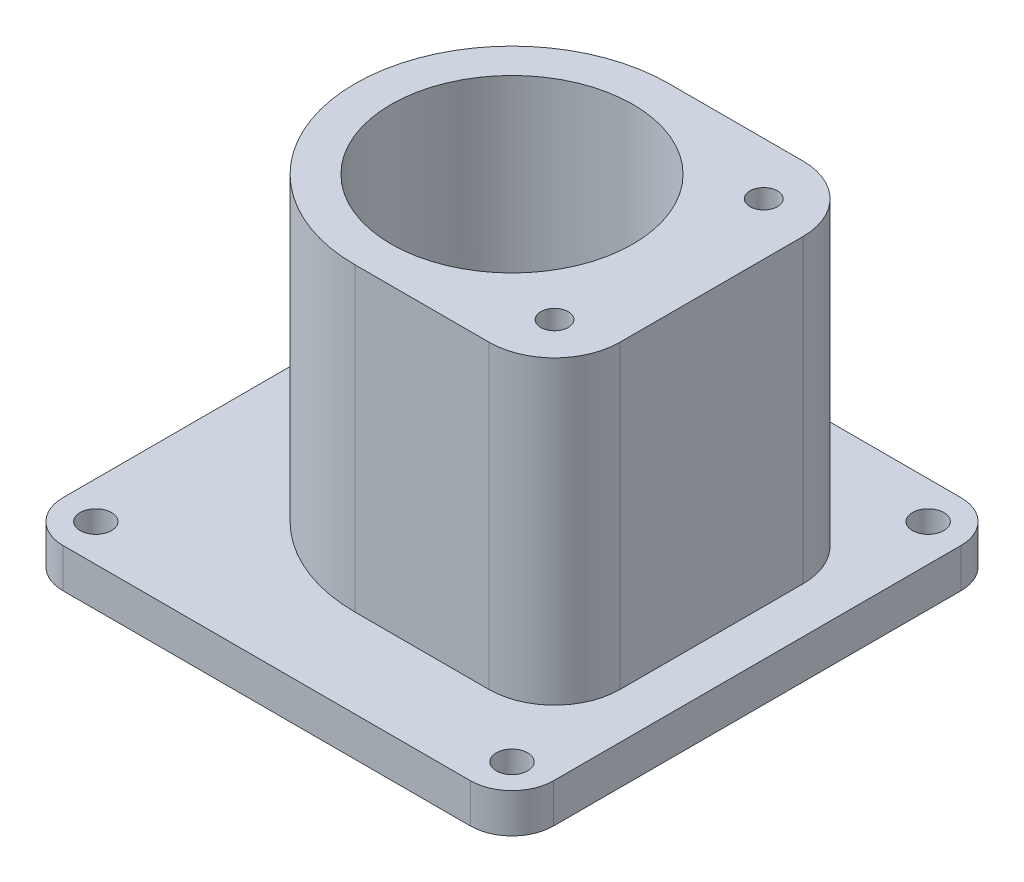
ISO-10303-21;
HEADER;
FILE_DESCRIPTION(('STEP AP214'),'2;1');
FILE_NAME('part.step','',(''),(''),'','','');
FILE_SCHEMA(('AUTOMOTIVE_DESIGN { 1 0 10303 214 1 1 1 1 }'));
ENDSEC;
DATA;
#1=APPLICATION_CONTEXT('core data for automotive mechanical design processes');
#2=APPLICATION_PROTOCOL_DEFINITION('international standard','automotive_design',2000,#1);
#3=PRODUCT_CONTEXT('',#1,'mechanical');
#4=PRODUCT('Part','Part','',(#3));
#5=PRODUCT_RELATED_PRODUCT_CATEGORY('part','',(#4));
#6=PRODUCT_DEFINITION_FORMATION('','',#4);
#7=PRODUCT_DEFINITION_CONTEXT('part definition',#1,'design');
#8=PRODUCT_DEFINITION('design','',#6,#7);
#9=PRODUCT_DEFINITION_SHAPE('','',#8);
#10=(LENGTH_UNIT() NAMED_UNIT(*) SI_UNIT(.MILLI.,.METRE.));
#11=(NAMED_UNIT(*) PLANE_ANGLE_UNIT() SI_UNIT($,.RADIAN.));
#12=(NAMED_UNIT(*) SI_UNIT($,.STERADIAN.) SOLID_ANGLE_UNIT());
#13=UNCERTAINTY_MEASURE_WITH_UNIT(LENGTH_MEASURE(1.E-05),#10,'distance_accuracy_value','');
#14=(GEOMETRIC_REPRESENTATION_CONTEXT(3) GLOBAL_UNCERTAINTY_ASSIGNED_CONTEXT((#13)) GLOBAL_UNIT_ASSIGNED_CONTEXT((#10,
#11,#12)) REPRESENTATION_CONTEXT('',''));
#15=CARTESIAN_POINT('',(0.,0.,0.));
#16=DIRECTION('',(0.,0.,1.));
#17=DIRECTION('',(1.,0.,0.));
#18=AXIS2_PLACEMENT_3D('',#15,#16,#17);
#19=CARTESIAN_POINT('',(-16.5,0.,0.));
#20=DIRECTION('',(0.,1.,0.));
#21=DIRECTION('',(0.,0.,1.));
#22=AXIS2_PLACEMENT_3D('',#19,#20,#21);
#23=PLANE('',#22);
#24=CARTESIAN_POINT('',(0.,0.,0.));
#25=DIRECTION('',(0.,-1.,0.));
#26=DIRECTION('',(0.,0.,-1.));
#27=AXIS2_PLACEMENT_3D('',#24,#25,#26);
#28=CIRCLE('',#27,16.5);
#29=CARTESIAN_POINT('',(0.,0.,-16.5));
#30=VERTEX_POINT('',#29);
#31=EDGE_CURVE('E258',#30,#30,#28,.T.);
#32=ORIENTED_EDGE('',*,*,#31,.F.);
#33=EDGE_LOOP('',(#32));
#34=FACE_BOUND('',#33,.T.);
#35=DIRECTION('',(0.,0.,1.));
#36=VECTOR('',#35,1.);
#37=CARTESIAN_POINT('',(37.5,0.,37.5));
#38=LINE('',#37,#36);
#39=CARTESIAN_POINT('',(37.5,0.,-31.15));
#40=VERTEX_POINT('',#39);
#41=CARTESIAN_POINT('',(37.5,0.,31.15));
#42=VERTEX_POINT('',#41);
#43=EDGE_CURVE('E260',#40,#42,#38,.T.);
#44=ORIENTED_EDGE('',*,*,#43,.T.);
#45=CARTESIAN_POINT('',(31.15,0.,31.15));
#46=DIRECTION('',(0.,1.,0.));
#47=DIRECTION('',(0.,0.,1.));
#48=AXIS2_PLACEMENT_3D('',#45,#46,#47);
#49=CIRCLE('',#48,6.35);
#50=CARTESIAN_POINT('',(31.15,0.,37.5));
#51=VERTEX_POINT('',#50);
#52=EDGE_CURVE('E334',#42,#51,#49,.F.);
#53=ORIENTED_EDGE('',*,*,#52,.T.);
#54=DIRECTION('',(-1.,0.,0.));
#55=VECTOR('',#54,1.);
#56=CARTESIAN_POINT('',(37.5,0.,37.5));
#57=LINE('',#56,#55);
#58=CARTESIAN_POINT('',(-31.15,0.,37.5));
#59=VERTEX_POINT('',#58);
#60=EDGE_CURVE('E254',#51,#59,#57,.T.);
#61=ORIENTED_EDGE('',*,*,#60,.T.);
#62=CARTESIAN_POINT('',(-31.15,0.,31.15));
#63=DIRECTION('',(0.,1.,0.));
#64=DIRECTION('',(0.,0.,1.));
#65=AXIS2_PLACEMENT_3D('',#62,#63,#64);
#66=CIRCLE('',#65,6.35);
#67=CARTESIAN_POINT('',(-37.5,0.,31.15));
#68=VERTEX_POINT('',#67);
#69=EDGE_CURVE('E331',#59,#68,#66,.F.);
#70=ORIENTED_EDGE('',*,*,#69,.T.);
#71=DIRECTION('',(0.,0.,-1.));
#72=VECTOR('',#71,1.);
#73=CARTESIAN_POINT('',(-37.5,0.,37.5));
#74=LINE('',#73,#72);
#75=CARTESIAN_POINT('',(-37.5,0.,-31.15));
#76=VERTEX_POINT('',#75);
#77=EDGE_CURVE('E259',#68,#76,#74,.T.);
#78=ORIENTED_EDGE('',*,*,#77,.T.);
#79=CARTESIAN_POINT('',(-31.15,0.,-31.15));
#80=DIRECTION('',(0.,1.,0.));
#81=DIRECTION('',(0.,0.,1.));
#82=AXIS2_PLACEMENT_3D('',#79,#80,#81);
#83=CIRCLE('',#82,6.35);
#84=CARTESIAN_POINT('',(-31.15,0.,-37.5));
#85=VERTEX_POINT('',#84);
#86=EDGE_CURVE('E325',#76,#85,#83,.F.);
#87=ORIENTED_EDGE('',*,*,#86,.T.);
#88=DIRECTION('',(1.,0.,0.));
#89=VECTOR('',#88,1.);
#90=CARTESIAN_POINT('',(37.5,0.,-37.5));
#91=LINE('',#90,#89);
#92=CARTESIAN_POINT('',(31.15,0.,-37.5));
#93=VERTEX_POINT('',#92);
#94=EDGE_CURVE('E264',#85,#93,#91,.T.);
#95=ORIENTED_EDGE('',*,*,#94,.T.);
#96=CARTESIAN_POINT('',(31.15,0.,-31.15));
#97=DIRECTION('',(0.,1.,0.));
#98=DIRECTION('',(0.,0.,1.));
#99=AXIS2_PLACEMENT_3D('',#96,#97,#98);
#100=CIRCLE('',#99,6.35);
#101=EDGE_CURVE('E328',#93,#40,#100,.F.);
#102=ORIENTED_EDGE('',*,*,#101,.T.);
#103=EDGE_LOOP('',(#44,#53,#61,#70,#78,#87,#95,#102));
#104=FACE_BOUND('',#103,.T.);
#105=CARTESIAN_POINT('',(31.8198051533946,0.,31.8198051533946));
#106=DIRECTION('',(0.,-1.,0.));
#107=DIRECTION('',(0.,0.,-1.));
#108=AXIS2_PLACEMENT_3D('',#105,#106,#107);
#109=CIRCLE('',#108,2.4);
#110=CARTESIAN_POINT('',(31.8198051533946,0.,29.4198051533946));
#111=VERTEX_POINT('',#110);
#112=EDGE_CURVE('E245',#111,#111,#109,.T.);
#113=ORIENTED_EDGE('',*,*,#112,.F.);
#114=EDGE_LOOP('',(#113));
#115=FACE_BOUND('',#114,.T.);
#116=CARTESIAN_POINT('',(-31.8198051533947,0.,31.8198051533946));
#117=DIRECTION('',(0.,-1.,0.));
#118=DIRECTION('',(0.,0.,-1.));
#119=AXIS2_PLACEMENT_3D('',#116,#117,#118);
#120=CIRCLE('',#119,2.4);
#121=CARTESIAN_POINT('',(-31.8198051533947,0.,29.4198051533946));
#122=VERTEX_POINT('',#121);
#123=EDGE_CURVE('E237',#122,#122,#120,.T.);
#124=ORIENTED_EDGE('',*,*,#123,.F.);
#125=EDGE_LOOP('',(#124));
#126=FACE_BOUND('',#125,.T.);
#127=CARTESIAN_POINT('',(-31.8198051533947,0.,-31.8198051533946));
#128=DIRECTION('',(0.,-1.,0.));
#129=DIRECTION('',(0.,0.,-1.));
#130=AXIS2_PLACEMENT_3D('',#127,#128,#129);
#131=CIRCLE('',#130,2.4);
#132=CARTESIAN_POINT('',(-31.8198051533947,0.,-34.2198051533946));
#133=VERTEX_POINT('',#132);
#134=EDGE_CURVE('E229',#133,#133,#131,.T.);
#135=ORIENTED_EDGE('',*,*,#134,.F.);
#136=EDGE_LOOP('',(#135));
#137=FACE_BOUND('',#136,.T.);
#138=CARTESIAN_POINT('',(31.8198051533946,0.,-31.8198051533946));
#139=DIRECTION('',(0.,-1.,0.));
#140=DIRECTION('',(0.,0.,-1.));
#141=AXIS2_PLACEMENT_3D('',#138,#139,#140);
#142=CIRCLE('',#141,2.4);
#143=CARTESIAN_POINT('',(31.8198051533946,0.,-34.2198051533946));
#144=VERTEX_POINT('',#143);
#145=EDGE_CURVE('E213',#144,#144,#142,.T.);
#146=ORIENTED_EDGE('',*,*,#145,.F.);
#147=EDGE_LOOP('',(#146));
#148=FACE_BOUND('',#147,.T.);
#149=ADVANCED_FACE('F45',(#34,#104,#115,#126,#137,#148),#23,.F.);
#150=CARTESIAN_POINT('',(-34.,6.,0.));
#151=DIRECTION('',(0.,-1.,0.));
#152=DIRECTION('',(0.,0.,-1.));
#153=AXIS2_PLACEMENT_3D('',#150,#151,#152);
#154=PLANE('',#153);
#155=CARTESIAN_POINT('',(31.8198051533946,6.,-31.8198051533946));
#156=DIRECTION('',(0.,-1.,0.));
#157=DIRECTION('',(0.,0.,-1.));
#158=AXIS2_PLACEMENT_3D('',#155,#156,#157);
#159=CIRCLE('',#158,2.4);
#160=CARTESIAN_POINT('',(31.8198051533946,6.,-34.2198051533946));
#161=VERTEX_POINT('',#160);
#162=EDGE_CURVE('E225',#161,#161,#159,.T.);
#163=ORIENTED_EDGE('',*,*,#162,.T.);
#164=EDGE_LOOP('',(#163));
#165=FACE_BOUND('',#164,.T.);
#166=CARTESIAN_POINT('',(-31.8198051533947,6.,-31.8198051533946));
#167=DIRECTION('',(0.,-1.,0.));
#168=DIRECTION('',(0.,0.,-1.));
#169=AXIS2_PLACEMENT_3D('',#166,#167,#168);
#170=CIRCLE('',#169,2.4);
#171=CARTESIAN_POINT('',(-31.8198051533947,6.,-34.2198051533946));
#172=VERTEX_POINT('',#171);
#173=EDGE_CURVE('E233',#172,#172,#170,.T.);
#174=ORIENTED_EDGE('',*,*,#173,.T.);
#175=EDGE_LOOP('',(#174));
#176=FACE_BOUND('',#175,.T.);
#177=CARTESIAN_POINT('',(-31.8198051533947,6.,31.8198051533946));
#178=DIRECTION('',(0.,-1.,0.));
#179=DIRECTION('',(0.,0.,-1.));
#180=AXIS2_PLACEMENT_3D('',#177,#178,#179);
#181=CIRCLE('',#180,2.4);
#182=CARTESIAN_POINT('',(-31.8198051533947,6.,29.4198051533946));
#183=VERTEX_POINT('',#182);
#184=EDGE_CURVE('E241',#183,#183,#181,.T.);
#185=ORIENTED_EDGE('',*,*,#184,.T.);
#186=EDGE_LOOP('',(#185));
#187=FACE_BOUND('',#186,.T.);
#188=CARTESIAN_POINT('',(31.8198051533946,6.,31.8198051533946));
#189=DIRECTION('',(0.,-1.,0.));
#190=DIRECTION('',(0.,0.,-1.));
#191=AXIS2_PLACEMENT_3D('',#188,#189,#190);
#192=CIRCLE('',#191,2.4);
#193=CARTESIAN_POINT('',(31.8198051533946,6.,29.4198051533946));
#194=VERTEX_POINT('',#193);
#195=EDGE_CURVE('E249',#194,#194,#192,.T.);
#196=ORIENTED_EDGE('',*,*,#195,.T.);
#197=EDGE_LOOP('',(#196));
#198=FACE_BOUND('',#197,.T.);
#199=CARTESIAN_POINT('',(0.,6.,0.));
#200=DIRECTION('',(0.,-1.,0.));
#201=DIRECTION('',(0.,0.,-1.));
#202=AXIS2_PLACEMENT_3D('',#199,#200,#201);
#203=CIRCLE('',#202,24.);
#204=CARTESIAN_POINT('',(0.,6.,24.));
#205=VERTEX_POINT('',#204);
#206=CARTESIAN_POINT('',(0.,6.,-24.));
#207=VERTEX_POINT('',#206);
#208=EDGE_CURVE('E160',#205,#207,#203,.T.);
#209=ORIENTED_EDGE('',*,*,#208,.T.);
#210=DIRECTION('',(-1.,0.,0.));
#211=VECTOR('',#210,1.);
#212=CARTESIAN_POINT('',(0.,6.00000000000001,-24.));
#213=LINE('',#212,#211);
#214=CARTESIAN_POINT('',(20.5,6.00000000000001,-24.));
#215=VERTEX_POINT('',#214);
#216=EDGE_CURVE('E164',#215,#207,#213,.T.);
#217=ORIENTED_EDGE('',*,*,#216,.F.);
#218=CARTESIAN_POINT('',(20.5,6.00000000000001,-14.));
#219=DIRECTION('',(0.,-1.,0.));
#220=DIRECTION('',(0.,0.,-1.));
#221=AXIS2_PLACEMENT_3D('',#218,#219,#220);
#222=CIRCLE('',#221,10.);
#223=CARTESIAN_POINT('',(30.5,6.00000000000001,-14.));
#224=VERTEX_POINT('',#223);
#225=EDGE_CURVE('E11',#215,#224,#222,.T.);
#226=ORIENTED_EDGE('',*,*,#225,.T.);
#227=DIRECTION('',(0.,0.,-1.));
#228=VECTOR('',#227,1.);
#229=CARTESIAN_POINT('',(30.5,6.00000000000001,-24.));
#230=LINE('',#229,#228);
#231=CARTESIAN_POINT('',(30.5,6.00000000000001,14.));
#232=VERTEX_POINT('',#231);
#233=EDGE_CURVE('E214',#232,#224,#230,.T.);
#234=ORIENTED_EDGE('',*,*,#233,.F.);
#235=CARTESIAN_POINT('',(20.5,6.00000000000001,14.));
#236=DIRECTION('',(0.,-1.,0.));
#237=DIRECTION('',(0.,0.,-1.));
#238=AXIS2_PLACEMENT_3D('',#235,#236,#237);
#239=CIRCLE('',#238,10.);
#240=CARTESIAN_POINT('',(20.5,6.00000000000001,24.));
#241=VERTEX_POINT('',#240);
#242=EDGE_CURVE('E54',#232,#241,#239,.T.);
#243=ORIENTED_EDGE('',*,*,#242,.T.);
#244=DIRECTION('',(1.,0.,0.));
#245=VECTOR('',#244,1.);
#246=CARTESIAN_POINT('',(30.5,6.00000000000001,24.));
#247=LINE('',#246,#245);
#248=EDGE_CURVE('E210',#205,#241,#247,.T.);
#249=ORIENTED_EDGE('',*,*,#248,.F.);
#250=EDGE_LOOP('',(#209,#217,#226,#234,#243,#249));
#251=FACE_BOUND('',#250,.T.);
#252=DIRECTION('',(1.,0.,0.));
#253=VECTOR('',#252,1.);
#254=CARTESIAN_POINT('',(37.5,6.,37.5));
#255=LINE('',#254,#253);
#256=CARTESIAN_POINT('',(-31.15,6.,37.5));
#257=VERTEX_POINT('',#256);
#258=CARTESIAN_POINT('',(31.15,6.,37.5));
#259=VERTEX_POINT('',#258);
#260=EDGE_CURVE('E275',#257,#259,#255,.T.);
#261=ORIENTED_EDGE('',*,*,#260,.T.);
#262=CARTESIAN_POINT('',(31.15,6.00000000000001,31.15));
#263=DIRECTION('',(0.,-1.,0.));
#264=DIRECTION('',(0.,0.,-1.));
#265=AXIS2_PLACEMENT_3D('',#262,#263,#264);
#266=CIRCLE('',#265,6.35);
#267=CARTESIAN_POINT('',(37.5,6.,31.15));
#268=VERTEX_POINT('',#267);
#269=EDGE_CURVE('E315',#259,#268,#266,.F.);
#270=ORIENTED_EDGE('',*,*,#269,.T.);
#271=DIRECTION('',(0.,0.,-1.));
#272=VECTOR('',#271,1.);
#273=CARTESIAN_POINT('',(37.5,6.,37.5));
#274=LINE('',#273,#272);
#275=CARTESIAN_POINT('',(37.5,6.,-31.15));
#276=VERTEX_POINT('',#275);
#277=EDGE_CURVE('E279',#268,#276,#274,.T.);
#278=ORIENTED_EDGE('',*,*,#277,.T.);
#279=CARTESIAN_POINT('',(31.15,6.00000000000001,-31.15));
#280=DIRECTION('',(0.,-1.,0.));
#281=DIRECTION('',(0.,0.,-1.));
#282=AXIS2_PLACEMENT_3D('',#279,#280,#281);
#283=CIRCLE('',#282,6.35);
#284=CARTESIAN_POINT('',(31.15,6.,-37.5));
#285=VERTEX_POINT('',#284);
#286=EDGE_CURVE('E309',#276,#285,#283,.F.);
#287=ORIENTED_EDGE('',*,*,#286,.T.);
#288=DIRECTION('',(-1.,0.,0.));
#289=VECTOR('',#288,1.);
#290=CARTESIAN_POINT('',(37.5,6.,-37.5));
#291=LINE('',#290,#289);
#292=CARTESIAN_POINT('',(-31.15,6.,-37.5));
#293=VERTEX_POINT('',#292);
#294=EDGE_CURVE('E265',#285,#293,#291,.T.);
#295=ORIENTED_EDGE('',*,*,#294,.T.);
#296=CARTESIAN_POINT('',(-31.15,6.00000000000001,-31.15));
#297=DIRECTION('',(0.,-1.,0.));
#298=DIRECTION('',(0.,0.,-1.));
#299=AXIS2_PLACEMENT_3D('',#296,#297,#298);
#300=CIRCLE('',#299,6.35);
#301=CARTESIAN_POINT('',(-37.5,6.,-31.15));
#302=VERTEX_POINT('',#301);
#303=EDGE_CURVE('E306',#293,#302,#300,.F.);
#304=ORIENTED_EDGE('',*,*,#303,.T.);
#305=DIRECTION('',(0.,0.,1.));
#306=VECTOR('',#305,1.);
#307=CARTESIAN_POINT('',(-37.5,6.,37.5));
#308=LINE('',#307,#306);
#309=CARTESIAN_POINT('',(-37.5,6.,31.15));
#310=VERTEX_POINT('',#309);
#311=EDGE_CURVE('E253',#302,#310,#308,.T.);
#312=ORIENTED_EDGE('',*,*,#311,.T.);
#313=CARTESIAN_POINT('',(-31.15,6.00000000000001,31.15));
#314=DIRECTION('',(0.,-1.,0.));
#315=DIRECTION('',(0.,0.,-1.));
#316=AXIS2_PLACEMENT_3D('',#313,#314,#315);
#317=CIRCLE('',#316,6.35);
#318=EDGE_CURVE('E312',#310,#257,#317,.F.);
#319=ORIENTED_EDGE('',*,*,#318,.T.);
#320=EDGE_LOOP('',(#261,#270,#278,#287,#295,#304,#312,#319));
#321=FACE_BOUND('',#320,.T.);
#322=ADVANCED_FACE('F362',(#165,#176,#187,#198,#251,#321),#154,.F.);
#323=CARTESIAN_POINT('',(0.,0.,0.));
#324=DIRECTION('',(0.,-1.,0.));
#325=DIRECTION('',(0.,0.,-1.));
#326=AXIS2_PLACEMENT_3D('',#323,#324,#325);
#327=CYLINDRICAL_SURFACE('',#326,24.);
#328=DIRECTION('',(0.,1.,0.));
#329=VECTOR('',#328,1.);
#330=CARTESIAN_POINT('',(0.,-66.624031835199,24.));
#331=LINE('',#330,#329);
#332=CARTESIAN_POINT('',(0.,52.,24.));
#333=VERTEX_POINT('',#332);
#334=EDGE_CURVE('E153',#205,#333,#331,.T.);
#335=ORIENTED_EDGE('',*,*,#334,.T.);
#336=CARTESIAN_POINT('',(0.,52.,0.));
#337=DIRECTION('',(0.,1.,0.));
#338=DIRECTION('',(0.,0.,1.));
#339=AXIS2_PLACEMENT_3D('',#336,#337,#338);
#340=CIRCLE('',#339,24.);
#341=CARTESIAN_POINT('',(0.,52.,-24.));
#342=VERTEX_POINT('',#341);
#343=EDGE_CURVE('E158',#342,#333,#340,.T.);
#344=ORIENTED_EDGE('',*,*,#343,.F.);
#345=DIRECTION('',(0.,1.,0.));
#346=VECTOR('',#345,1.);
#347=CARTESIAN_POINT('',(0.,-66.624031835199,-24.));
#348=LINE('',#347,#346);
#349=EDGE_CURVE('E217',#207,#342,#348,.T.);
#350=ORIENTED_EDGE('',*,*,#349,.F.);
#351=ORIENTED_EDGE('',*,*,#208,.F.);
#352=EDGE_LOOP('',(#335,#344,#350,#351));
#353=FACE_BOUND('',#352,.T.);
#354=ADVANCED_FACE('F155',(#353),#327,.T.);
#355=CARTESIAN_POINT('',(0.,0.,0.));
#356=DIRECTION('',(0.,-1.,0.));
#357=DIRECTION('',(0.,0.,-1.));
#358=AXIS2_PLACEMENT_3D('',#355,#356,#357);
#359=CYLINDRICAL_SURFACE('',#358,18.5);
#360=CARTESIAN_POINT('',(0.,13.,0.));
#361=DIRECTION('',(0.,-1.,0.));
#362=DIRECTION('',(0.,0.,-1.));
#363=AXIS2_PLACEMENT_3D('',#360,#361,#362);
#364=CIRCLE('',#363,18.5);
#365=CARTESIAN_POINT('',(0.,13.,-18.5));
#366=VERTEX_POINT('',#365);
#367=EDGE_CURVE('E293',#366,#366,#364,.T.);
#368=ORIENTED_EDGE('',*,*,#367,.T.);
#369=EDGE_LOOP('',(#368));
#370=FACE_BOUND('',#369,.T.);
#371=CARTESIAN_POINT('',(0.,52.,0.));
#372=DIRECTION('',(0.,1.,0.));
#373=DIRECTION('',(0.,0.,1.));
#374=AXIS2_PLACEMENT_3D('',#371,#372,#373);
#375=CIRCLE('',#374,18.5);
#376=CARTESIAN_POINT('',(0.,52.,18.5));
#377=VERTEX_POINT('',#376);
#378=EDGE_CURVE('E184',#377,#377,#375,.T.);
#379=ORIENTED_EDGE('',*,*,#378,.T.);
#380=EDGE_LOOP('',(#379));
#381=FACE_BOUND('',#380,.T.);
#382=ADVANCED_FACE('F408',(#370,#381),#359,.F.);
#383=CARTESIAN_POINT('',(-18.5,13.,0.));
#384=DIRECTION('',(0.,-1.,0.));
#385=DIRECTION('',(0.,0.,-1.));
#386=AXIS2_PLACEMENT_3D('',#383,#384,#385);
#387=PLANE('',#386);
#388=ORIENTED_EDGE('',*,*,#367,.F.);
#389=EDGE_LOOP('',(#388));
#390=FACE_BOUND('',#389,.T.);
#391=CARTESIAN_POINT('',(0.,13.,0.));
#392=DIRECTION('',(0.,-1.,0.));
#393=DIRECTION('',(0.,0.,-1.));
#394=AXIS2_PLACEMENT_3D('',#391,#392,#393);
#395=CIRCLE('',#394,16.5);
#396=CARTESIAN_POINT('',(0.,13.,-16.5));
#397=VERTEX_POINT('',#396);
#398=EDGE_CURVE('E289',#397,#397,#395,.T.);
#399=ORIENTED_EDGE('',*,*,#398,.T.);
#400=EDGE_LOOP('',(#399));
#401=FACE_BOUND('',#400,.T.);
#402=ADVANCED_FACE('F404',(#390,#401),#387,.F.);
#403=CARTESIAN_POINT('',(0.,0.,0.));
#404=DIRECTION('',(0.,-1.,0.));
#405=DIRECTION('',(0.,0.,-1.));
#406=AXIS2_PLACEMENT_3D('',#403,#404,#405);
#407=CYLINDRICAL_SURFACE('',#406,16.5);
#408=ORIENTED_EDGE('',*,*,#398,.F.);
#409=EDGE_LOOP('',(#408));
#410=FACE_BOUND('',#409,.T.);
#411=ORIENTED_EDGE('',*,*,#31,.T.);
#412=EDGE_LOOP('',(#411));
#413=FACE_BOUND('',#412,.T.);
#414=ADVANCED_FACE('F400',(#410,#413),#407,.F.);
#415=CARTESIAN_POINT('',(37.5,-106.066017177982,37.5));
#416=DIRECTION('',(0.,0.,1.));
#417=DIRECTION('',(1.,0.,0.));
#418=AXIS2_PLACEMENT_3D('',#415,#416,#417);
#419=PLANE('',#418);
#420=ORIENTED_EDGE('',*,*,#60,.F.);
#421=DIRECTION('',(0.,1.,0.));
#422=VECTOR('',#421,1.);
#423=CARTESIAN_POINT('',(31.15,-106.066017177982,37.5));
#424=LINE('',#423,#422);
#425=EDGE_CURVE('E302',#51,#259,#424,.T.);
#426=ORIENTED_EDGE('',*,*,#425,.T.);
#427=ORIENTED_EDGE('',*,*,#260,.F.);
#428=DIRECTION('',(0.,1.,0.));
#429=VECTOR('',#428,1.);
#430=CARTESIAN_POINT('',(-31.15,-106.066017177982,37.5));
#431=LINE('',#430,#429);
#432=EDGE_CURVE('E299',#257,#59,#431,.F.);
#433=ORIENTED_EDGE('',*,*,#432,.T.);
#434=EDGE_LOOP('',(#420,#426,#427,#433));
#435=FACE_BOUND('',#434,.T.);
#436=ADVANCED_FACE('F403',(#435),#419,.T.);
#437=CARTESIAN_POINT('',(37.5,-106.066017177982,37.5));
#438=DIRECTION('',(1.,0.,0.));
#439=DIRECTION('',(0.,0.,-1.));
#440=AXIS2_PLACEMENT_3D('',#437,#438,#439);
#441=PLANE('',#440);
#442=ORIENTED_EDGE('',*,*,#277,.F.);
#443=DIRECTION('',(0.,1.,0.));
#444=VECTOR('',#443,1.);
#445=CARTESIAN_POINT('',(37.5,-106.066017177982,31.15));
#446=LINE('',#445,#444);
#447=EDGE_CURVE('E322',#268,#42,#446,.F.);
#448=ORIENTED_EDGE('',*,*,#447,.T.);
#449=ORIENTED_EDGE('',*,*,#43,.F.);
#450=DIRECTION('',(0.,1.,0.));
#451=VECTOR('',#450,1.);
#452=CARTESIAN_POINT('',(37.5,-106.066017177982,-31.15));
#453=LINE('',#452,#451);
#454=EDGE_CURVE('E318',#40,#276,#453,.T.);
#455=ORIENTED_EDGE('',*,*,#454,.T.);
#456=EDGE_LOOP('',(#442,#448,#449,#455));
#457=FACE_BOUND('',#456,.T.);
#458=ADVANCED_FACE('F618',(#457),#441,.T.);
#459=CARTESIAN_POINT('',(37.5,-106.066017177982,-37.5));
#460=DIRECTION('',(0.,0.,-1.));
#461=DIRECTION('',(-1.,0.,0.));
#462=AXIS2_PLACEMENT_3D('',#459,#460,#461);
#463=PLANE('',#462);
#464=ORIENTED_EDGE('',*,*,#294,.F.);
#465=DIRECTION('',(0.,1.,0.));
#466=VECTOR('',#465,1.);
#467=CARTESIAN_POINT('',(31.15,-106.066017177982,-37.5));
#468=LINE('',#467,#466);
#469=EDGE_CURVE('E348',#285,#93,#468,.F.);
#470=ORIENTED_EDGE('',*,*,#469,.T.);
#471=ORIENTED_EDGE('',*,*,#94,.F.);
#472=DIRECTION('',(0.,1.,0.));
#473=VECTOR('',#472,1.);
#474=CARTESIAN_POINT('',(-31.15,-106.066017177982,-37.5));
#475=LINE('',#474,#473);
#476=EDGE_CURVE('E344',#85,#293,#475,.T.);
#477=ORIENTED_EDGE('',*,*,#476,.T.);
#478=EDGE_LOOP('',(#464,#470,#471,#477));
#479=FACE_BOUND('',#478,.T.);
#480=ADVANCED_FACE('F608',(#479),#463,.T.);
#481=CARTESIAN_POINT('',(-37.5,-106.066017177982,37.5));
#482=DIRECTION('',(-1.,0.,0.));
#483=DIRECTION('',(0.,0.,1.));
#484=AXIS2_PLACEMENT_3D('',#481,#482,#483);
#485=PLANE('',#484);
#486=ORIENTED_EDGE('',*,*,#77,.F.);
#487=DIRECTION('',(0.,1.,0.));
#488=VECTOR('',#487,1.);
#489=CARTESIAN_POINT('',(-37.5,-106.066017177982,31.15));
#490=LINE('',#489,#488);
#491=EDGE_CURVE('E340',#68,#310,#490,.T.);
#492=ORIENTED_EDGE('',*,*,#491,.T.);
#493=ORIENTED_EDGE('',*,*,#311,.F.);
#494=DIRECTION('',(0.,1.,0.));
#495=VECTOR('',#494,1.);
#496=CARTESIAN_POINT('',(-37.5,-106.066017177982,-31.15));
#497=LINE('',#496,#495);
#498=EDGE_CURVE('E337',#302,#76,#497,.F.);
#499=ORIENTED_EDGE('',*,*,#498,.T.);
#500=EDGE_LOOP('',(#486,#492,#493,#499));
#501=FACE_BOUND('',#500,.T.);
#502=ADVANCED_FACE('F398',(#501),#485,.T.);
#503=CARTESIAN_POINT('',(31.8198051533946,0.,31.8198051533946));
#504=DIRECTION('',(0.,-1.,0.));
#505=DIRECTION('',(0.,0.,-1.));
#506=AXIS2_PLACEMENT_3D('',#503,#504,#505);
#507=CYLINDRICAL_SURFACE('',#506,2.4);
#508=ORIENTED_EDGE('',*,*,#195,.F.);
#509=EDGE_LOOP('',(#508));
#510=FACE_BOUND('',#509,.T.);
#511=ORIENTED_EDGE('',*,*,#112,.T.);
#512=EDGE_LOOP('',(#511));
#513=FACE_BOUND('',#512,.T.);
#514=ADVANCED_FACE('F607',(#510,#513),#507,.F.);
#515=CARTESIAN_POINT('',(-31.8198051533947,0.,31.8198051533946));
#516=DIRECTION('',(0.,-1.,0.));
#517=DIRECTION('',(0.,0.,-1.));
#518=AXIS2_PLACEMENT_3D('',#515,#516,#517);
#519=CYLINDRICAL_SURFACE('',#518,2.4);
#520=ORIENTED_EDGE('',*,*,#184,.F.);
#521=EDGE_LOOP('',(#520));
#522=FACE_BOUND('',#521,.T.);
#523=ORIENTED_EDGE('',*,*,#123,.T.);
#524=EDGE_LOOP('',(#523));
#525=FACE_BOUND('',#524,.T.);
#526=ADVANCED_FACE('F656',(#522,#525),#519,.F.);
#527=CARTESIAN_POINT('',(-31.8198051533947,0.,-31.8198051533946));
#528=DIRECTION('',(0.,-1.,0.));
#529=DIRECTION('',(0.,0.,-1.));
#530=AXIS2_PLACEMENT_3D('',#527,#528,#529);
#531=CYLINDRICAL_SURFACE('',#530,2.4);
#532=ORIENTED_EDGE('',*,*,#173,.F.);
#533=EDGE_LOOP('',(#532));
#534=FACE_BOUND('',#533,.T.);
#535=ORIENTED_EDGE('',*,*,#134,.T.);
#536=EDGE_LOOP('',(#535));
#537=FACE_BOUND('',#536,.T.);
#538=ADVANCED_FACE('F647',(#534,#537),#531,.F.);
#539=CARTESIAN_POINT('',(31.8198051533946,0.,-31.8198051533946));
#540=DIRECTION('',(0.,-1.,0.));
#541=DIRECTION('',(0.,0.,-1.));
#542=AXIS2_PLACEMENT_3D('',#539,#540,#541);
#543=CYLINDRICAL_SURFACE('',#542,2.4);
#544=ORIENTED_EDGE('',*,*,#162,.F.);
#545=EDGE_LOOP('',(#544));
#546=FACE_BOUND('',#545,.T.);
#547=ORIENTED_EDGE('',*,*,#145,.T.);
#548=EDGE_LOOP('',(#547));
#549=FACE_BOUND('',#548,.T.);
#550=ADVANCED_FACE('F418',(#546,#549),#543,.F.);
#551=CARTESIAN_POINT('',(31.15,-106.066017177982,31.15));
#552=DIRECTION('',(0.,1.,0.));
#553=DIRECTION('',(0.,0.,1.));
#554=AXIS2_PLACEMENT_3D('',#551,#552,#553);
#555=CYLINDRICAL_SURFACE('',#554,6.35);
#556=ORIENTED_EDGE('',*,*,#52,.F.);
#557=ORIENTED_EDGE('',*,*,#447,.F.);
#558=ORIENTED_EDGE('',*,*,#269,.F.);
#559=ORIENTED_EDGE('',*,*,#425,.F.);
#560=EDGE_LOOP('',(#556,#557,#558,#559));
#561=FACE_BOUND('',#560,.T.);
#562=ADVANCED_FACE('F414',(#561),#555,.T.);
#563=CARTESIAN_POINT('',(-31.15,-106.066017177982,31.15));
#564=DIRECTION('',(0.,1.,0.));
#565=DIRECTION('',(0.,0.,1.));
#566=AXIS2_PLACEMENT_3D('',#563,#564,#565);
#567=CYLINDRICAL_SURFACE('',#566,6.35);
#568=ORIENTED_EDGE('',*,*,#69,.F.);
#569=ORIENTED_EDGE('',*,*,#432,.F.);
#570=ORIENTED_EDGE('',*,*,#318,.F.);
#571=ORIENTED_EDGE('',*,*,#491,.F.);
#572=EDGE_LOOP('',(#568,#569,#570,#571));
#573=FACE_BOUND('',#572,.T.);
#574=ADVANCED_FACE('F417',(#573),#567,.T.);
#575=CARTESIAN_POINT('',(31.15,-106.066017177982,-31.15));
#576=DIRECTION('',(0.,1.,0.));
#577=DIRECTION('',(0.,0.,1.));
#578=AXIS2_PLACEMENT_3D('',#575,#576,#577);
#579=CYLINDRICAL_SURFACE('',#578,6.35);
#580=ORIENTED_EDGE('',*,*,#101,.F.);
#581=ORIENTED_EDGE('',*,*,#469,.F.);
#582=ORIENTED_EDGE('',*,*,#286,.F.);
#583=ORIENTED_EDGE('',*,*,#454,.F.);
#584=EDGE_LOOP('',(#580,#581,#582,#583));
#585=FACE_BOUND('',#584,.T.);
#586=ADVANCED_FACE('F382',(#585),#579,.T.);
#587=CARTESIAN_POINT('',(-31.15,-106.066017177982,-31.15));
#588=DIRECTION('',(0.,1.,0.));
#589=DIRECTION('',(0.,0.,1.));
#590=AXIS2_PLACEMENT_3D('',#587,#588,#589);
#591=CYLINDRICAL_SURFACE('',#590,6.35);
#592=ORIENTED_EDGE('',*,*,#86,.F.);
#593=ORIENTED_EDGE('',*,*,#498,.F.);
#594=ORIENTED_EDGE('',*,*,#303,.F.);
#595=ORIENTED_EDGE('',*,*,#476,.F.);
#596=EDGE_LOOP('',(#592,#593,#594,#595));
#597=FACE_BOUND('',#596,.T.);
#598=ADVANCED_FACE('F374',(#597),#591,.T.);
#599=CARTESIAN_POINT('',(0.,-66.624031835199,-24.));
#600=DIRECTION('',(0.,0.,-1.));
#601=DIRECTION('',(-1.,0.,0.));
#602=AXIS2_PLACEMENT_3D('',#599,#600,#601);
#603=PLANE('',#602);
#604=ORIENTED_EDGE('',*,*,#349,.T.);
#605=DIRECTION('',(-1.,0.,0.));
#606=VECTOR('',#605,1.);
#607=CARTESIAN_POINT('',(20.5,52.,-24.));
#608=LINE('',#607,#606);
#609=CARTESIAN_POINT('',(20.5,52.,-24.));
#610=VERTEX_POINT('',#609);
#611=EDGE_CURVE('E182',#610,#342,#608,.T.);
#612=ORIENTED_EDGE('',*,*,#611,.F.);
#613=DIRECTION('',(0.,1.,0.));
#614=VECTOR('',#613,1.);
#615=CARTESIAN_POINT('',(20.5,-66.624031835199,-24.));
#616=LINE('',#615,#614);
#617=EDGE_CURVE('E61',#610,#215,#616,.F.);
#618=ORIENTED_EDGE('',*,*,#617,.T.);
#619=ORIENTED_EDGE('',*,*,#216,.T.);
#620=EDGE_LOOP('',(#604,#612,#618,#619));
#621=FACE_BOUND('',#620,.T.);
#622=ADVANCED_FACE('F372',(#621),#603,.T.);
#623=CARTESIAN_POINT('',(30.5,-66.624031835199,-24.));
#624=DIRECTION('',(1.,0.,0.));
#625=DIRECTION('',(0.,0.,-1.));
#626=AXIS2_PLACEMENT_3D('',#623,#624,#625);
#627=PLANE('',#626);
#628=DIRECTION('',(0.,1.,0.));
#629=VECTOR('',#628,1.);
#630=CARTESIAN_POINT('',(30.5,-66.624031835199,-14.));
#631=LINE('',#630,#629);
#632=CARTESIAN_POINT('',(30.5,52.,-14.));
#633=VERTEX_POINT('',#632);
#634=EDGE_CURVE('E353',#224,#633,#631,.T.);
#635=ORIENTED_EDGE('',*,*,#634,.T.);
#636=DIRECTION('',(0.,0.,-1.));
#637=VECTOR('',#636,1.);
#638=CARTESIAN_POINT('',(30.5,52.,14.));
#639=LINE('',#638,#637);
#640=CARTESIAN_POINT('',(30.5,52.,14.));
#641=VERTEX_POINT('',#640);
#642=EDGE_CURVE('E194',#641,#633,#639,.T.);
#643=ORIENTED_EDGE('',*,*,#642,.F.);
#644=DIRECTION('',(0.,1.,0.));
#645=VECTOR('',#644,1.);
#646=CARTESIAN_POINT('',(30.5,-66.624031835199,14.));
#647=LINE('',#646,#645);
#648=EDGE_CURVE('E356',#641,#232,#647,.F.);
#649=ORIENTED_EDGE('',*,*,#648,.T.);
#650=ORIENTED_EDGE('',*,*,#233,.T.);
#651=EDGE_LOOP('',(#635,#643,#649,#650));
#652=FACE_BOUND('',#651,.T.);
#653=ADVANCED_FACE('F369',(#652),#627,.T.);
#654=CARTESIAN_POINT('',(30.5,-66.624031835199,24.));
#655=DIRECTION('',(0.,0.,1.));
#656=DIRECTION('',(1.,0.,0.));
#657=AXIS2_PLACEMENT_3D('',#654,#655,#656);
#658=PLANE('',#657);
#659=ORIENTED_EDGE('',*,*,#248,.T.);
#660=DIRECTION('',(0.,1.,0.));
#661=VECTOR('',#660,1.);
#662=CARTESIAN_POINT('',(20.5,-66.624031835199,24.));
#663=LINE('',#662,#661);
#664=CARTESIAN_POINT('',(20.5,52.,24.));
#665=VERTEX_POINT('',#664);
#666=EDGE_CURVE('E171',#241,#665,#663,.T.);
#667=ORIENTED_EDGE('',*,*,#666,.T.);
#668=DIRECTION('',(1.,0.,0.));
#669=VECTOR('',#668,1.);
#670=CARTESIAN_POINT('',(0.,52.,24.));
#671=LINE('',#670,#669);
#672=EDGE_CURVE('E168',#333,#665,#671,.T.);
#673=ORIENTED_EDGE('',*,*,#672,.F.);
#674=ORIENTED_EDGE('',*,*,#334,.F.);
#675=EDGE_LOOP('',(#659,#667,#673,#674));
#676=FACE_BOUND('',#675,.T.);
#677=ADVANCED_FACE('F169',(#676),#658,.T.);
#678=CARTESIAN_POINT('',(20.5,-66.624031835199,14.));
#679=DIRECTION('',(0.,1.,0.));
#680=DIRECTION('',(0.,0.,1.));
#681=AXIS2_PLACEMENT_3D('',#678,#679,#680);
#682=CYLINDRICAL_SURFACE('',#681,10.);
#683=ORIENTED_EDGE('',*,*,#242,.F.);
#684=ORIENTED_EDGE('',*,*,#648,.F.);
#685=CARTESIAN_POINT('',(20.5,52.,14.));
#686=DIRECTION('',(0.,1.,0.));
#687=DIRECTION('',(0.,0.,1.));
#688=AXIS2_PLACEMENT_3D('',#685,#686,#687);
#689=CIRCLE('',#688,10.);
#690=EDGE_CURVE('E176',#665,#641,#689,.T.);
#691=ORIENTED_EDGE('',*,*,#690,.F.);
#692=ORIENTED_EDGE('',*,*,#666,.F.);
#693=EDGE_LOOP('',(#683,#684,#691,#692));
#694=FACE_BOUND('',#693,.T.);
#695=ADVANCED_FACE('F365',(#694),#682,.T.);
#696=CARTESIAN_POINT('',(20.5,-66.624031835199,-14.));
#697=DIRECTION('',(0.,1.,0.));
#698=DIRECTION('',(0.,0.,1.));
#699=AXIS2_PLACEMENT_3D('',#696,#697,#698);
#700=CYLINDRICAL_SURFACE('',#699,10.);
#701=ORIENTED_EDGE('',*,*,#225,.F.);
#702=ORIENTED_EDGE('',*,*,#617,.F.);
#703=CARTESIAN_POINT('',(20.5,52.,-14.));
#704=DIRECTION('',(0.,1.,0.));
#705=DIRECTION('',(0.,0.,1.));
#706=AXIS2_PLACEMENT_3D('',#703,#704,#705);
#707=CIRCLE('',#706,10.);
#708=EDGE_CURVE('E198',#633,#610,#707,.T.);
#709=ORIENTED_EDGE('',*,*,#708,.F.);
#710=ORIENTED_EDGE('',*,*,#634,.F.);
#711=EDGE_LOOP('',(#701,#702,#709,#710));
#712=FACE_BOUND('',#711,.T.);
#713=ADVANCED_FACE('F47',(#712),#700,.T.);
#714=CARTESIAN_POINT('',(0.,52.,0.));
#715=DIRECTION('',(0.,1.,0.));
#716=DIRECTION('',(0.,0.,1.));
#717=AXIS2_PLACEMENT_3D('',#714,#715,#716);
#718=PLANE('',#717);
#719=CARTESIAN_POINT('',(22.5,52.,16.));
#720=DIRECTION('',(0.,1.,0.));
#721=DIRECTION('',(0.,0.,1.));
#722=AXIS2_PLACEMENT_3D('',#719,#720,#721);
#723=CIRCLE('',#722,2.1);
#724=CARTESIAN_POINT('',(22.5,52.,18.1));
#725=VERTEX_POINT('',#724);
#726=EDGE_CURVE('E188',#725,#725,#723,.T.);
#727=ORIENTED_EDGE('',*,*,#726,.F.);
#728=EDGE_LOOP('',(#727));
#729=FACE_BOUND('',#728,.T.);
#730=ORIENTED_EDGE('',*,*,#343,.T.);
#731=ORIENTED_EDGE('',*,*,#672,.T.);
#732=ORIENTED_EDGE('',*,*,#690,.T.);
#733=ORIENTED_EDGE('',*,*,#642,.T.);
#734=ORIENTED_EDGE('',*,*,#708,.T.);
#735=ORIENTED_EDGE('',*,*,#611,.T.);
#736=EDGE_LOOP('',(#730,#731,#732,#733,#734,#735));
#737=FACE_BOUND('',#736,.T.);
#738=ORIENTED_EDGE('',*,*,#378,.F.);
#739=EDGE_LOOP('',(#738));
#740=FACE_BOUND('',#739,.T.);
#741=CARTESIAN_POINT('',(22.5,52.,-16.));
#742=DIRECTION('',(0.,1.,0.));
#743=DIRECTION('',(0.,0.,1.));
#744=AXIS2_PLACEMENT_3D('',#741,#742,#743);
#745=CIRCLE('',#744,2.1);
#746=CARTESIAN_POINT('',(22.5,52.,-13.9));
#747=VERTEX_POINT('',#746);
#748=EDGE_CURVE('E458',#747,#747,#745,.T.);
#749=ORIENTED_EDGE('',*,*,#748,.F.);
#750=EDGE_LOOP('',(#749));
#751=FACE_BOUND('',#750,.T.);
#752=ADVANCED_FACE('F179',(#729,#737,#740,#751),#718,.T.);
#753=CARTESIAN_POINT('',(22.5,12.6,16.));
#754=DIRECTION('',(0.,1.,0.));
#755=DIRECTION('',(0.,0.,1.));
#756=AXIS2_PLACEMENT_3D('',#753,#754,#755);
#757=CONICAL_SURFACE('',#756,2.1,1.02974425867665);
#758=CARTESIAN_POINT('',(22.5,11.3381927000421,16.));
#759=VERTEX_POINT('',#758);
#760=VERTEX_LOOP('',#759);
#761=FACE_BOUND('',#760,.T.);
#762=CARTESIAN_POINT('',(22.5,12.6,16.));
#763=DIRECTION('',(0.,1.,0.));
#764=DIRECTION('',(0.,0.,1.));
#765=AXIS2_PLACEMENT_3D('',#762,#763,#764);
#766=CIRCLE('',#765,2.1);
#767=CARTESIAN_POINT('',(22.5,12.6,18.1));
#768=VERTEX_POINT('',#767);
#769=EDGE_CURVE('E165',#768,#768,#766,.T.);
#770=ORIENTED_EDGE('',*,*,#769,.T.);
#771=EDGE_LOOP('',(#770));
#772=FACE_BOUND('',#771,.T.);
#773=ADVANCED_FACE('F434',(#761,#772),#757,.F.);
#774=CARTESIAN_POINT('',(22.5,25.,16.));
#775=DIRECTION('',(0.,1.,0.));
#776=DIRECTION('',(0.,0.,1.));
#777=AXIS2_PLACEMENT_3D('',#774,#775,#776);
#778=CYLINDRICAL_SURFACE('',#777,2.1);
#779=ORIENTED_EDGE('',*,*,#769,.F.);
#780=EDGE_LOOP('',(#779));
#781=FACE_BOUND('',#780,.T.);
#782=ORIENTED_EDGE('',*,*,#726,.T.);
#783=EDGE_LOOP('',(#782));
#784=FACE_BOUND('',#783,.T.);
#785=ADVANCED_FACE('F437',(#781,#784),#778,.F.);
#786=CARTESIAN_POINT('',(22.5,12.6,-16.));
#787=DIRECTION('',(0.,1.,0.));
#788=DIRECTION('',(0.,0.,1.));
#789=AXIS2_PLACEMENT_3D('',#786,#787,#788);
#790=CONICAL_SURFACE('',#789,2.1,1.02974425867665);
#791=CARTESIAN_POINT('',(22.5,11.3381927000421,-16.));
#792=VERTEX_POINT('',#791);
#793=VERTEX_LOOP('',#792);
#794=FACE_BOUND('',#793,.T.);
#795=CARTESIAN_POINT('',(22.5,12.6,-16.));
#796=DIRECTION('',(0.,1.,0.));
#797=DIRECTION('',(0.,0.,1.));
#798=AXIS2_PLACEMENT_3D('',#795,#796,#797);
#799=CIRCLE('',#798,2.1);
#800=CARTESIAN_POINT('',(22.5,12.6,-13.9));
#801=VERTEX_POINT('',#800);
#802=EDGE_CURVE('E203',#801,#801,#799,.T.);
#803=ORIENTED_EDGE('',*,*,#802,.T.);
#804=EDGE_LOOP('',(#803));
#805=FACE_BOUND('',#804,.T.);
#806=ADVANCED_FACE('F441',(#794,#805),#790,.F.);
#807=CARTESIAN_POINT('',(22.5,25.,-16.));
#808=DIRECTION('',(0.,1.,0.));
#809=DIRECTION('',(0.,0.,1.));
#810=AXIS2_PLACEMENT_3D('',#807,#808,#809);
#811=CYLINDRICAL_SURFACE('',#810,2.1);
#812=ORIENTED_EDGE('',*,*,#802,.F.);
#813=EDGE_LOOP('',(#812));
#814=FACE_BOUND('',#813,.T.);
#815=ORIENTED_EDGE('',*,*,#748,.T.);
#816=EDGE_LOOP('',(#815));
#817=FACE_BOUND('',#816,.T.);
#818=ADVANCED_FACE('F445',(#814,#817),#811,.F.);
#819=CLOSED_SHELL('',(#149,#322,#354,#382,#402,#414,#436,#458,#480,#502,#514,#526,#538,#550,
#562,#574,#586,#598,#622,#653,#677,#695,#713,#752,#773,#785,#806,#818));
#820=MANIFOLD_SOLID_BREP('B2',#819);
#821=ADVANCED_BREP_SHAPE_REPRESENTATION('',(#18,#820),#14);
#822=SHAPE_DEFINITION_REPRESENTATION(#9,#821);
ENDSEC;
END-ISO-10303-21;
